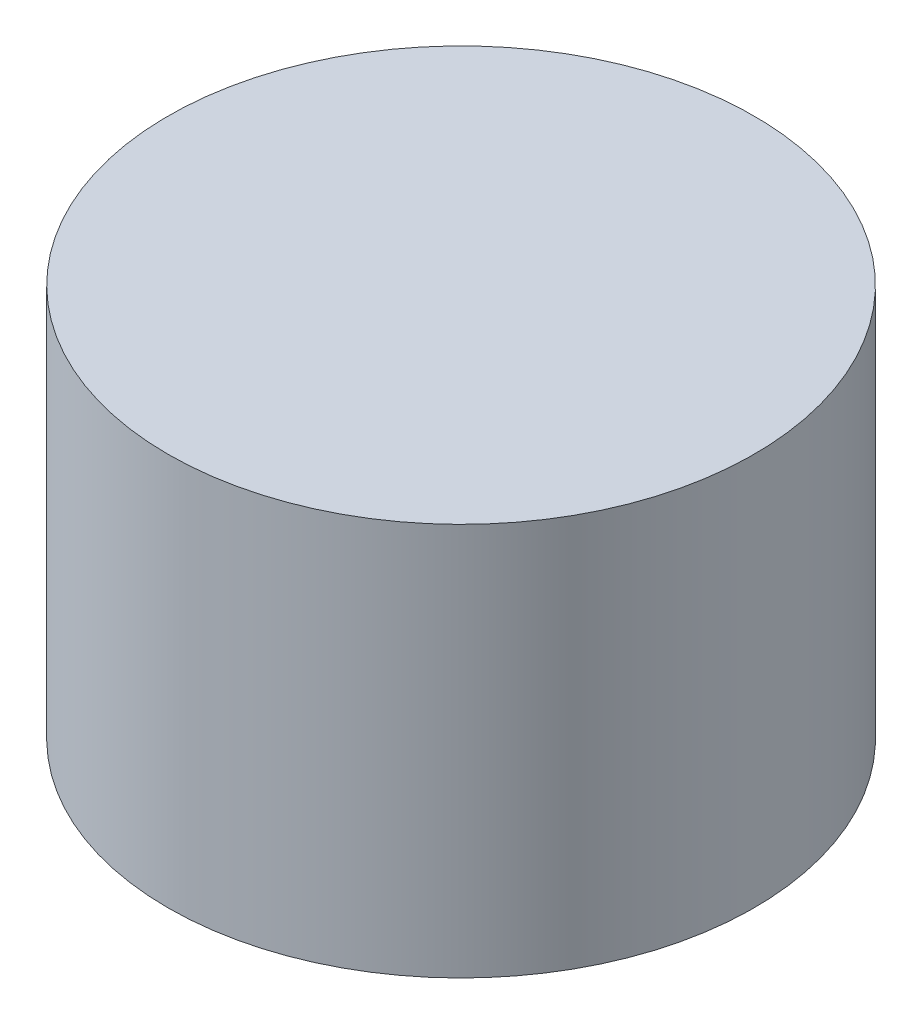
ISO-10303-21;
HEADER;
FILE_DESCRIPTION(('STEP AP214'),'2;1');
FILE_NAME('part.step','',(''),(''),'','','');
FILE_SCHEMA(('AUTOMOTIVE_DESIGN { 1 0 10303 214 1 1 1 1 }'));
ENDSEC;
DATA;
#1=APPLICATION_CONTEXT('core data for automotive mechanical design processes');
#2=APPLICATION_PROTOCOL_DEFINITION('international standard','automotive_design',2000,#1);
#3=PRODUCT_CONTEXT('',#1,'mechanical');
#4=PRODUCT('Part','Part','',(#3));
#5=PRODUCT_RELATED_PRODUCT_CATEGORY('part','',(#4));
#6=PRODUCT_DEFINITION_FORMATION('','',#4);
#7=PRODUCT_DEFINITION_CONTEXT('part definition',#1,'design');
#8=PRODUCT_DEFINITION('design','',#6,#7);
#9=PRODUCT_DEFINITION_SHAPE('','',#8);
#10=(LENGTH_UNIT() NAMED_UNIT(*) SI_UNIT(.MILLI.,.METRE.));
#11=(NAMED_UNIT(*) PLANE_ANGLE_UNIT() SI_UNIT($,.RADIAN.));
#12=(NAMED_UNIT(*) SI_UNIT($,.STERADIAN.) SOLID_ANGLE_UNIT());
#13=UNCERTAINTY_MEASURE_WITH_UNIT(LENGTH_MEASURE(1.E-05),#10,'distance_accuracy_value','');
#14=(GEOMETRIC_REPRESENTATION_CONTEXT(3) GLOBAL_UNCERTAINTY_ASSIGNED_CONTEXT((#13)) GLOBAL_UNIT_ASSIGNED_CONTEXT((#10,
#11,#12)) REPRESENTATION_CONTEXT('',''));
#15=CARTESIAN_POINT('',(0.,0.,0.));
#16=DIRECTION('',(0.,0.,1.));
#17=DIRECTION('',(1.,0.,0.));
#18=AXIS2_PLACEMENT_3D('',#15,#16,#17);
#19=CARTESIAN_POINT('',(0.,12.,0.));
#20=DIRECTION('',(0.,-1.,0.));
#21=DIRECTION('',(0.,0.,-1.));
#22=AXIS2_PLACEMENT_3D('',#19,#20,#21);
#23=CYLINDRICAL_SURFACE('',#22,8.95);
#24=CARTESIAN_POINT('',(0.,12.,0.));
#25=DIRECTION('',(0.,1.,0.));
#26=DIRECTION('',(0.,0.,1.));
#27=AXIS2_PLACEMENT_3D('',#24,#25,#26);
#28=CIRCLE('',#27,8.95);
#29=CARTESIAN_POINT('',(0.,12.,8.95));
#30=VERTEX_POINT('',#29);
#31=EDGE_CURVE('E10',#30,#30,#28,.T.);
#32=ORIENTED_EDGE('',*,*,#31,.F.);
#33=EDGE_LOOP('',(#32));
#34=FACE_BOUND('',#33,.T.);
#35=CARTESIAN_POINT('',(0.,0.,0.));
#36=DIRECTION('',(0.,1.,0.));
#37=DIRECTION('',(0.,0.,1.));
#38=AXIS2_PLACEMENT_3D('',#35,#36,#37);
#39=CIRCLE('',#38,8.95);
#40=CARTESIAN_POINT('',(0.,0.,8.95));
#41=VERTEX_POINT('',#40);
#42=EDGE_CURVE('E35',#41,#41,#39,.T.);
#43=ORIENTED_EDGE('',*,*,#42,.T.);
#44=EDGE_LOOP('',(#43));
#45=FACE_BOUND('',#44,.T.);
#46=ADVANCED_FACE('F32',(#34,#45),#23,.T.);
#47=CARTESIAN_POINT('',(0.,12.,0.));
#48=DIRECTION('',(0.,1.,0.));
#49=DIRECTION('',(0.,0.,1.));
#50=AXIS2_PLACEMENT_3D('',#47,#48,#49);
#51=PLANE('',#50);
#52=ORIENTED_EDGE('',*,*,#31,.T.);
#53=EDGE_LOOP('',(#52));
#54=FACE_BOUND('',#53,.T.);
#55=ADVANCED_FACE('F47',(#54),#51,.T.);
#56=CARTESIAN_POINT('',(0.,0.,0.));
#57=DIRECTION('',(0.,1.,0.));
#58=DIRECTION('',(0.,0.,1.));
#59=AXIS2_PLACEMENT_3D('',#56,#57,#58);
#60=PLANE('',#59);
#61=ORIENTED_EDGE('',*,*,#42,.F.);
#62=EDGE_LOOP('',(#61));
#63=FACE_BOUND('',#62,.T.);
#64=ADVANCED_FACE('F45',(#63),#60,.F.);
#65=CLOSED_SHELL('',(#46,#55,#64));
#66=MANIFOLD_SOLID_BREP('B2',#65);
#67=ADVANCED_BREP_SHAPE_REPRESENTATION('',(#18,#66),#14);
#68=SHAPE_DEFINITION_REPRESENTATION(#9,#67);
ENDSEC;
END-ISO-10303-21;
